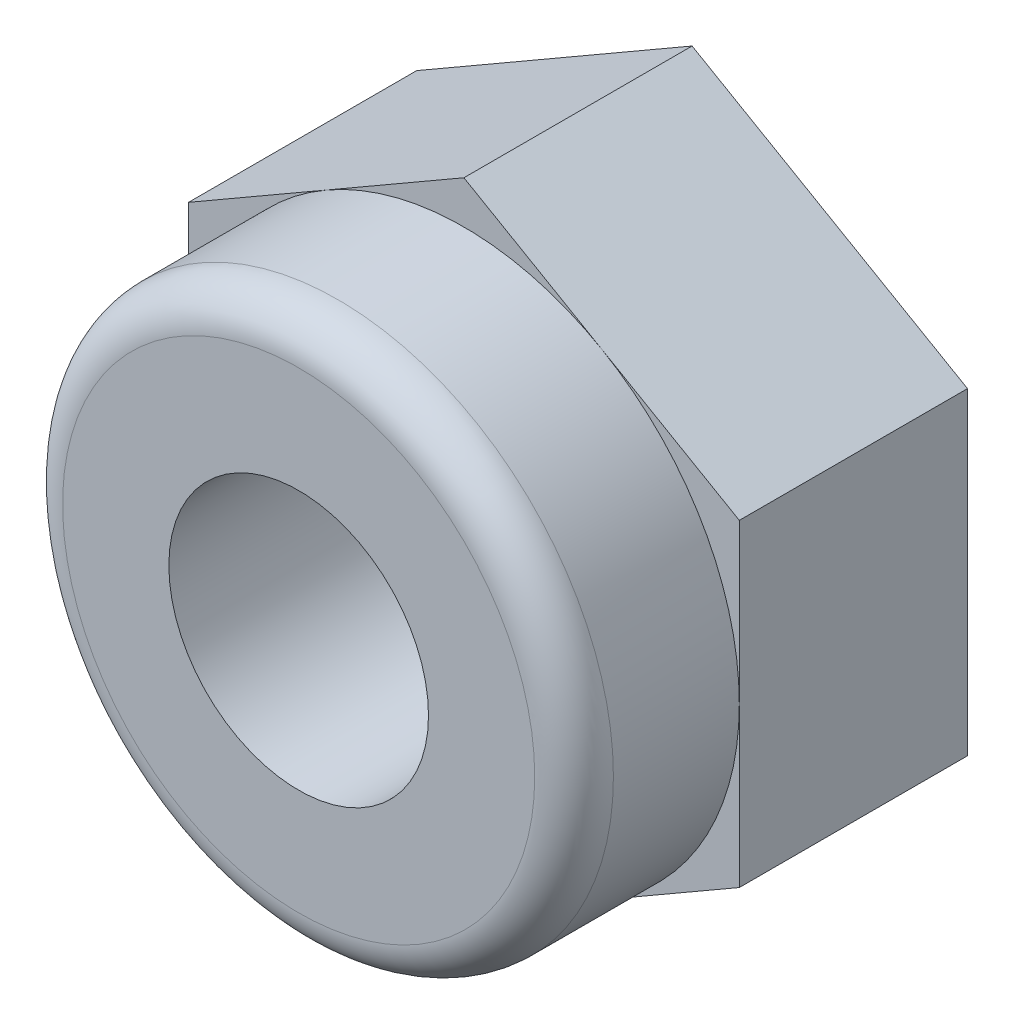
ISO-10303-21;
HEADER;
FILE_DESCRIPTION(('STEP AP214'),'2;1');
FILE_NAME('part.step','',(''),(''),'','','');
FILE_SCHEMA(('AUTOMOTIVE_DESIGN { 1 0 10303 214 1 1 1 1 }'));
ENDSEC;
DATA;
#1=APPLICATION_CONTEXT('core data for automotive mechanical design processes');
#2=APPLICATION_PROTOCOL_DEFINITION('international standard','automotive_design',2000,#1);
#3=PRODUCT_CONTEXT('',#1,'mechanical');
#4=PRODUCT('Part','Part','',(#3));
#5=PRODUCT_RELATED_PRODUCT_CATEGORY('part','',(#4));
#6=PRODUCT_DEFINITION_FORMATION('','',#4);
#7=PRODUCT_DEFINITION_CONTEXT('part definition',#1,'design');
#8=PRODUCT_DEFINITION('design','',#6,#7);
#9=PRODUCT_DEFINITION_SHAPE('','',#8);
#10=(LENGTH_UNIT() NAMED_UNIT(*) SI_UNIT(.MILLI.,.METRE.));
#11=(NAMED_UNIT(*) PLANE_ANGLE_UNIT() SI_UNIT($,.RADIAN.));
#12=(NAMED_UNIT(*) SI_UNIT($,.STERADIAN.) SOLID_ANGLE_UNIT());
#13=UNCERTAINTY_MEASURE_WITH_UNIT(LENGTH_MEASURE(1.E-05),#10,'distance_accuracy_value','');
#14=(GEOMETRIC_REPRESENTATION_CONTEXT(3) GLOBAL_UNCERTAINTY_ASSIGNED_CONTEXT((#13)) GLOBAL_UNIT_ASSIGNED_CONTEXT((#10,
#11,#12)) REPRESENTATION_CONTEXT('',''));
#15=CARTESIAN_POINT('',(0.,0.,0.));
#16=DIRECTION('',(0.,0.,1.));
#17=DIRECTION('',(1.,0.,0.));
#18=AXIS2_PLACEMENT_3D('',#15,#16,#17);
#19=CARTESIAN_POINT('',(0.,0.,2.9));
#20=DIRECTION('',(0.,0.,1.));
#21=DIRECTION('',(1.,0.,0.));
#22=AXIS2_PLACEMENT_3D('',#19,#20,#21);
#23=PLANE('',#22);
#24=CARTESIAN_POINT('',(0.,0.,2.9));
#25=DIRECTION('',(0.,0.,1.));
#26=DIRECTION('',(1.,0.,0.));
#27=AXIS2_PLACEMENT_3D('',#24,#25,#26);
#28=CIRCLE('',#27,3.49999999999999);
#29=CARTESIAN_POINT('',(3.49999999999999,0.,2.9));
#30=VERTEX_POINT('',#29);
#31=CARTESIAN_POINT('',(1.74999999999999,3.03108891324555,2.9));
#32=VERTEX_POINT('',#31);
#33=EDGE_CURVE('E125',#30,#32,#28,.T.);
#34=ORIENTED_EDGE('',*,*,#33,.F.);
#35=DIRECTION('',(0.,1.,0.));
#36=VECTOR('',#35,1.);
#37=CARTESIAN_POINT('',(3.50000000000001,-2.02072594216365,2.9));
#38=LINE('',#37,#36);
#39=CARTESIAN_POINT('',(3.49999999999997,2.02072594216373,2.9));
#40=VERTEX_POINT('',#39);
#41=EDGE_CURVE('E114',#30,#40,#38,.T.);
#42=ORIENTED_EDGE('',*,*,#41,.T.);
#43=DIRECTION('',(-0.866025403784442,0.499999999999995,0.));
#44=VECTOR('',#43,1.);
#45=CARTESIAN_POINT('',(3.49999999999997,2.02072594216373,2.9));
#46=LINE('',#45,#44);
#47=EDGE_CURVE('E126',#40,#32,#46,.T.);
#48=ORIENTED_EDGE('',*,*,#47,.T.);
#49=EDGE_LOOP('',(#34,#42,#48));
#50=FACE_BOUND('',#49,.T.);
#51=ADVANCED_FACE('F36',(#50),#23,.T.);
#52=CARTESIAN_POINT('',(-1.75,3.03108891324553,2.9));
#53=VERTEX_POINT('',#52);
#54=EDGE_CURVE('E132',#32,#53,#28,.T.);
#55=ORIENTED_EDGE('',*,*,#54,.F.);
#56=CARTESIAN_POINT('',(0.,4.04145188432737,2.9));
#57=VERTEX_POINT('',#56);
#58=EDGE_CURVE('E145',#32,#57,#46,.T.);
#59=ORIENTED_EDGE('',*,*,#58,.T.);
#60=DIRECTION('',(-0.866025403784438,-0.500000000000001,0.));
#61=VECTOR('',#60,1.);
#62=CARTESIAN_POINT('',(0.,4.04145188432737,2.9));
#63=LINE('',#62,#61);
#64=EDGE_CURVE('E146',#57,#53,#63,.T.);
#65=ORIENTED_EDGE('',*,*,#64,.T.);
#66=EDGE_LOOP('',(#55,#59,#65));
#67=FACE_BOUND('',#66,.T.);
#68=ADVANCED_FACE('F226',(#67),#23,.T.);
#69=CARTESIAN_POINT('',(-3.49999999999999,0.,2.9));
#70=VERTEX_POINT('',#69);
#71=EDGE_CURVE('E183',#53,#70,#28,.T.);
#72=ORIENTED_EDGE('',*,*,#71,.F.);
#73=CARTESIAN_POINT('',(-3.5,2.02072594216368,2.9));
#74=VERTEX_POINT('',#73);
#75=EDGE_CURVE('E144',#53,#74,#63,.T.);
#76=ORIENTED_EDGE('',*,*,#75,.T.);
#77=DIRECTION('',(0.,-1.,0.));
#78=VECTOR('',#77,1.);
#79=CARTESIAN_POINT('',(-3.5,2.02072594216368,2.9));
#80=LINE('',#79,#78);
#81=EDGE_CURVE('E150',#74,#70,#80,.T.);
#82=ORIENTED_EDGE('',*,*,#81,.T.);
#83=EDGE_LOOP('',(#72,#76,#82));
#84=FACE_BOUND('',#83,.T.);
#85=ADVANCED_FACE('F194',(#84),#23,.T.);
#86=CARTESIAN_POINT('',(-1.74999999999998,-3.03108891324554,2.9));
#87=VERTEX_POINT('',#86);
#88=EDGE_CURVE('E136',#70,#87,#28,.T.);
#89=ORIENTED_EDGE('',*,*,#88,.F.);
#90=CARTESIAN_POINT('',(-3.49999999999998,-2.0207259421637,2.9));
#91=VERTEX_POINT('',#90);
#92=EDGE_CURVE('E149',#70,#91,#80,.T.);
#93=ORIENTED_EDGE('',*,*,#92,.T.);
#94=DIRECTION('',(0.866025403784442,-0.499999999999995,0.));
#95=VECTOR('',#94,1.);
#96=CARTESIAN_POINT('',(-3.49999999999998,-2.0207259421637,2.9));
#97=LINE('',#96,#95);
#98=EDGE_CURVE('E154',#91,#87,#97,.T.);
#99=ORIENTED_EDGE('',*,*,#98,.T.);
#100=EDGE_LOOP('',(#89,#93,#99));
#101=FACE_BOUND('',#100,.T.);
#102=ADVANCED_FACE('F187',(#101),#23,.T.);
#103=CARTESIAN_POINT('',(1.75000000000002,-3.03108891324551,2.9));
#104=VERTEX_POINT('',#103);
#105=EDGE_CURVE('E59',#87,#104,#28,.T.);
#106=ORIENTED_EDGE('',*,*,#105,.F.);
#107=CARTESIAN_POINT('',(0.,-4.04145188432737,2.9));
#108=VERTEX_POINT('',#107);
#109=EDGE_CURVE('E153',#87,#108,#97,.T.);
#110=ORIENTED_EDGE('',*,*,#109,.T.);
#111=DIRECTION('',(0.866025403784435,0.500000000000007,0.));
#112=VECTOR('',#111,1.);
#113=CARTESIAN_POINT('',(0.,-4.04145188432737,2.9));
#114=LINE('',#113,#112);
#115=EDGE_CURVE('E123',#108,#104,#114,.T.);
#116=ORIENTED_EDGE('',*,*,#115,.T.);
#117=EDGE_LOOP('',(#106,#110,#116));
#118=FACE_BOUND('',#117,.T.);
#119=ADVANCED_FACE('F213',(#118),#23,.T.);
#120=CARTESIAN_POINT('',(3.49999999999997,2.02072594216373,2.9));
#121=DIRECTION('',(-0.499999999999995,-0.866025403784442,0.));
#122=DIRECTION('',(0.866025403784442,-0.499999999999995,0.));
#123=AXIS2_PLACEMENT_3D('',#120,#121,#122);
#124=PLANE('',#123);
#125=DIRECTION('',(-0.866025403784442,0.499999999999995,0.));
#126=VECTOR('',#125,1.);
#127=CARTESIAN_POINT('',(3.49999999999997,2.02072594216373,0.));
#128=LINE('',#127,#126);
#129=CARTESIAN_POINT('',(3.49999999999997,2.02072594216373,0.));
#130=VERTEX_POINT('',#129);
#131=CARTESIAN_POINT('',(0.,4.04145188432737,0.));
#132=VERTEX_POINT('',#131);
#133=EDGE_CURVE('E129',#130,#132,#128,.T.);
#134=ORIENTED_EDGE('',*,*,#133,.T.);
#135=DIRECTION('',(0.,0.,-1.));
#136=VECTOR('',#135,1.);
#137=CARTESIAN_POINT('',(0.,4.04145188432737,2.9));
#138=LINE('',#137,#136);
#139=EDGE_CURVE('E135',#57,#132,#138,.T.);
#140=ORIENTED_EDGE('',*,*,#139,.F.);
#141=ORIENTED_EDGE('',*,*,#58,.F.);
#142=ORIENTED_EDGE('',*,*,#47,.F.);
#143=DIRECTION('',(0.,0.,-1.));
#144=VECTOR('',#143,1.);
#145=CARTESIAN_POINT('',(3.49999999999997,2.02072594216373,2.9));
#146=LINE('',#145,#144);
#147=EDGE_CURVE('E113',#40,#130,#146,.T.);
#148=ORIENTED_EDGE('',*,*,#147,.T.);
#149=EDGE_LOOP('',(#134,#140,#141,#142,#148));
#150=FACE_BOUND('',#149,.T.);
#151=ADVANCED_FACE('F215',(#150),#124,.F.);
#152=CARTESIAN_POINT('',(0.,4.04145188432737,2.9));
#153=DIRECTION('',(0.500000000000001,-0.866025403784438,0.));
#154=DIRECTION('',(0.866025403784438,0.500000000000001,0.));
#155=AXIS2_PLACEMENT_3D('',#152,#153,#154);
#156=PLANE('',#155);
#157=DIRECTION('',(-0.866025403784438,-0.500000000000001,0.));
#158=VECTOR('',#157,1.);
#159=CARTESIAN_POINT('',(0.,4.04145188432737,0.));
#160=LINE('',#159,#158);
#161=CARTESIAN_POINT('',(-3.5,2.02072594216368,0.));
#162=VERTEX_POINT('',#161);
#163=EDGE_CURVE('E160',#132,#162,#160,.T.);
#164=ORIENTED_EDGE('',*,*,#163,.T.);
#165=DIRECTION('',(0.,0.,-1.));
#166=VECTOR('',#165,1.);
#167=CARTESIAN_POINT('',(-3.5,2.02072594216368,2.9));
#168=LINE('',#167,#166);
#169=EDGE_CURVE('E138',#74,#162,#168,.T.);
#170=ORIENTED_EDGE('',*,*,#169,.F.);
#171=ORIENTED_EDGE('',*,*,#75,.F.);
#172=ORIENTED_EDGE('',*,*,#64,.F.);
#173=ORIENTED_EDGE('',*,*,#139,.T.);
#174=EDGE_LOOP('',(#164,#170,#171,#172,#173));
#175=FACE_BOUND('',#174,.T.);
#176=ADVANCED_FACE('F199',(#175),#156,.F.);
#177=CARTESIAN_POINT('',(-3.5,2.02072594216368,2.9));
#178=DIRECTION('',(1.,0.,0.));
#179=DIRECTION('',(0.,1.,0.));
#180=AXIS2_PLACEMENT_3D('',#177,#178,#179);
#181=PLANE('',#180);
#182=DIRECTION('',(0.,-1.,0.));
#183=VECTOR('',#182,1.);
#184=CARTESIAN_POINT('',(-3.5,2.02072594216368,0.));
#185=LINE('',#184,#183);
#186=CARTESIAN_POINT('',(-3.49999999999998,-2.0207259421637,0.));
#187=VERTEX_POINT('',#186);
#188=EDGE_CURVE('E162',#162,#187,#185,.T.);
#189=ORIENTED_EDGE('',*,*,#188,.T.);
#190=DIRECTION('',(0.,0.,-1.));
#191=VECTOR('',#190,1.);
#192=CARTESIAN_POINT('',(-3.49999999999998,-2.0207259421637,2.9));
#193=LINE('',#192,#191);
#194=EDGE_CURVE('E176',#91,#187,#193,.T.);
#195=ORIENTED_EDGE('',*,*,#194,.F.);
#196=ORIENTED_EDGE('',*,*,#92,.F.);
#197=ORIENTED_EDGE('',*,*,#81,.F.);
#198=ORIENTED_EDGE('',*,*,#169,.T.);
#199=EDGE_LOOP('',(#189,#195,#196,#197,#198));
#200=FACE_BOUND('',#199,.T.);
#201=ADVANCED_FACE('F192',(#200),#181,.F.);
#202=CARTESIAN_POINT('',(-3.49999999999998,-2.0207259421637,2.9));
#203=DIRECTION('',(0.499999999999995,0.866025403784442,0.));
#204=DIRECTION('',(-0.866025403784442,0.499999999999995,0.));
#205=AXIS2_PLACEMENT_3D('',#202,#203,#204);
#206=PLANE('',#205);
#207=DIRECTION('',(0.866025403784442,-0.499999999999995,0.));
#208=VECTOR('',#207,1.);
#209=CARTESIAN_POINT('',(-3.49999999999998,-2.0207259421637,0.));
#210=LINE('',#209,#208);
#211=CARTESIAN_POINT('',(0.,-4.04145188432737,0.));
#212=VERTEX_POINT('',#211);
#213=EDGE_CURVE('E164',#187,#212,#210,.T.);
#214=ORIENTED_EDGE('',*,*,#213,.T.);
#215=DIRECTION('',(0.,0.,-1.));
#216=VECTOR('',#215,1.);
#217=CARTESIAN_POINT('',(0.,-4.04145188432737,2.9));
#218=LINE('',#217,#216);
#219=EDGE_CURVE('E173',#108,#212,#218,.T.);
#220=ORIENTED_EDGE('',*,*,#219,.F.);
#221=ORIENTED_EDGE('',*,*,#109,.F.);
#222=ORIENTED_EDGE('',*,*,#98,.F.);
#223=ORIENTED_EDGE('',*,*,#194,.T.);
#224=EDGE_LOOP('',(#214,#220,#221,#222,#223));
#225=FACE_BOUND('',#224,.T.);
#226=ADVANCED_FACE('F209',(#225),#206,.F.);
#227=CARTESIAN_POINT('',(0.,-4.04145188432737,2.9));
#228=DIRECTION('',(-0.500000000000007,0.866025403784435,0.));
#229=DIRECTION('',(-0.866025403784435,-0.500000000000007,0.));
#230=AXIS2_PLACEMENT_3D('',#227,#228,#229);
#231=PLANE('',#230);
#232=DIRECTION('',(0.866025403784435,0.500000000000007,0.));
#233=VECTOR('',#232,1.);
#234=CARTESIAN_POINT('',(0.,-4.04145188432737,0.));
#235=LINE('',#234,#233);
#236=CARTESIAN_POINT('',(3.50000000000001,-2.02072594216365,0.));
#237=VERTEX_POINT('',#236);
#238=EDGE_CURVE('E166',#212,#237,#235,.T.);
#239=ORIENTED_EDGE('',*,*,#238,.T.);
#240=DIRECTION('',(0.,0.,-1.));
#241=VECTOR('',#240,1.);
#242=CARTESIAN_POINT('',(3.50000000000001,-2.02072594216365,2.9));
#243=LINE('',#242,#241);
#244=CARTESIAN_POINT('',(3.50000000000001,-2.02072594216365,2.9));
#245=VERTEX_POINT('',#244);
#246=EDGE_CURVE('E171',#245,#237,#243,.T.);
#247=ORIENTED_EDGE('',*,*,#246,.F.);
#248=EDGE_CURVE('E109',#104,#245,#114,.T.);
#249=ORIENTED_EDGE('',*,*,#248,.F.);
#250=ORIENTED_EDGE('',*,*,#115,.F.);
#251=ORIENTED_EDGE('',*,*,#219,.T.);
#252=EDGE_LOOP('',(#239,#247,#249,#250,#251));
#253=FACE_BOUND('',#252,.T.);
#254=ADVANCED_FACE('F212',(#253),#231,.F.);
#255=CARTESIAN_POINT('',(3.50000000000001,-2.02072594216365,2.9));
#256=DIRECTION('',(-1.,0.,0.));
#257=DIRECTION('',(0.,-1.,0.));
#258=AXIS2_PLACEMENT_3D('',#255,#256,#257);
#259=PLANE('',#258);
#260=DIRECTION('',(0.,1.,0.));
#261=VECTOR('',#260,1.);
#262=CARTESIAN_POINT('',(3.50000000000001,-2.02072594216365,0.));
#263=LINE('',#262,#261);
#264=EDGE_CURVE('E168',#237,#130,#263,.T.);
#265=ORIENTED_EDGE('',*,*,#264,.T.);
#266=ORIENTED_EDGE('',*,*,#147,.F.);
#267=ORIENTED_EDGE('',*,*,#41,.F.);
#268=EDGE_CURVE('E106',#245,#30,#38,.T.);
#269=ORIENTED_EDGE('',*,*,#268,.F.);
#270=ORIENTED_EDGE('',*,*,#246,.T.);
#271=EDGE_LOOP('',(#265,#266,#267,#269,#270));
#272=FACE_BOUND('',#271,.T.);
#273=ADVANCED_FACE('F118',(#272),#259,.F.);
#274=EDGE_CURVE('E51',#104,#30,#28,.T.);
#275=ORIENTED_EDGE('',*,*,#274,.F.);
#276=ORIENTED_EDGE('',*,*,#248,.T.);
#277=ORIENTED_EDGE('',*,*,#268,.T.);
#278=EDGE_LOOP('',(#275,#276,#277));
#279=FACE_BOUND('',#278,.T.);
#280=ADVANCED_FACE('F108',(#279),#23,.T.);
#281=CARTESIAN_POINT('',(0.,0.,0.));
#282=DIRECTION('',(0.,0.,1.));
#283=DIRECTION('',(1.,0.,0.));
#284=AXIS2_PLACEMENT_3D('',#281,#282,#283);
#285=PLANE('',#284);
#286=CARTESIAN_POINT('',(0.,0.,0.));
#287=DIRECTION('',(0.,0.,1.));
#288=DIRECTION('',(1.,0.,0.));
#289=AXIS2_PLACEMENT_3D('',#286,#287,#288);
#290=CIRCLE('',#289,1.65);
#291=CARTESIAN_POINT('',(1.65,0.,0.));
#292=VERTEX_POINT('',#291);
#293=EDGE_CURVE('E130',#292,#292,#290,.T.);
#294=ORIENTED_EDGE('',*,*,#293,.T.);
#295=EDGE_LOOP('',(#294));
#296=FACE_BOUND('',#295,.T.);
#297=ORIENTED_EDGE('',*,*,#133,.F.);
#298=ORIENTED_EDGE('',*,*,#264,.F.);
#299=ORIENTED_EDGE('',*,*,#238,.F.);
#300=ORIENTED_EDGE('',*,*,#213,.F.);
#301=ORIENTED_EDGE('',*,*,#188,.F.);
#302=ORIENTED_EDGE('',*,*,#163,.F.);
#303=EDGE_LOOP('',(#297,#298,#299,#300,#301,#302));
#304=FACE_BOUND('',#303,.T.);
#305=ADVANCED_FACE('F204',(#296,#304),#285,.F.);
#306=CARTESIAN_POINT('',(0.,0.,5.));
#307=DIRECTION('',(0.,0.,-1.));
#308=DIRECTION('',(-1.,0.,0.));
#309=AXIS2_PLACEMENT_3D('',#306,#307,#308);
#310=CYLINDRICAL_SURFACE('',#309,3.49999999999999);
#311=CARTESIAN_POINT('',(0.,0.,4.5));
#312=DIRECTION('',(0.,0.,1.));
#313=DIRECTION('',(1.,0.,0.));
#314=AXIS2_PLACEMENT_3D('',#311,#312,#313);
#315=CIRCLE('',#314,3.49999999999999);
#316=CARTESIAN_POINT('',(3.49999999999999,0.,4.5));
#317=VERTEX_POINT('',#316);
#318=EDGE_CURVE('E11',#317,#317,#315,.F.);
#319=ORIENTED_EDGE('',*,*,#318,.T.);
#320=EDGE_LOOP('',(#319));
#321=FACE_BOUND('',#320,.T.);
#322=ORIENTED_EDGE('',*,*,#33,.T.);
#323=ORIENTED_EDGE('',*,*,#54,.T.);
#324=ORIENTED_EDGE('',*,*,#71,.T.);
#325=ORIENTED_EDGE('',*,*,#88,.T.);
#326=ORIENTED_EDGE('',*,*,#105,.T.);
#327=ORIENTED_EDGE('',*,*,#274,.T.);
#328=EDGE_LOOP('',(#322,#323,#324,#325,#326,#327));
#329=FACE_BOUND('',#328,.T.);
#330=ADVANCED_FACE('F133',(#321,#329),#310,.T.);
#331=CARTESIAN_POINT('',(0.,0.,5.));
#332=DIRECTION('',(0.,0.,1.));
#333=DIRECTION('',(1.,0.,0.));
#334=AXIS2_PLACEMENT_3D('',#331,#332,#333);
#335=PLANE('',#334);
#336=CARTESIAN_POINT('',(0.,0.,5.));
#337=DIRECTION('',(0.,0.,1.));
#338=DIRECTION('',(1.,0.,0.));
#339=AXIS2_PLACEMENT_3D('',#336,#337,#338);
#340=CIRCLE('',#339,1.65);
#341=CARTESIAN_POINT('',(1.65,0.,5.));
#342=VERTEX_POINT('',#341);
#343=EDGE_CURVE('E354',#342,#342,#340,.T.);
#344=ORIENTED_EDGE('',*,*,#343,.F.);
#345=EDGE_LOOP('',(#344));
#346=FACE_BOUND('',#345,.T.);
#347=CARTESIAN_POINT('',(0.,0.,5.));
#348=DIRECTION('',(0.,0.,1.));
#349=DIRECTION('',(1.,0.,0.));
#350=AXIS2_PLACEMENT_3D('',#347,#348,#349);
#351=CIRCLE('',#350,2.99999999999999);
#352=CARTESIAN_POINT('',(2.99999999999999,0.,5.));
#353=VERTEX_POINT('',#352);
#354=EDGE_CURVE('E44',#353,#353,#351,.T.);
#355=ORIENTED_EDGE('',*,*,#354,.T.);
#356=EDGE_LOOP('',(#355));
#357=FACE_BOUND('',#356,.T.);
#358=ADVANCED_FACE('F309',(#346,#357),#335,.T.);
#359=CARTESIAN_POINT('',(0.,0.,4.5));
#360=DIRECTION('',(0.,0.,1.));
#361=DIRECTION('',(1.,0.,0.));
#362=AXIS2_PLACEMENT_3D('',#359,#360,#361);
#363=TOROIDAL_SURFACE('',#362,2.99999999999999,0.5);
#364=ORIENTED_EDGE('',*,*,#318,.F.);
#365=EDGE_LOOP('',(#364));
#366=FACE_BOUND('',#365,.T.);
#367=ORIENTED_EDGE('',*,*,#354,.F.);
#368=EDGE_LOOP('',(#367));
#369=FACE_BOUND('',#368,.T.);
#370=ADVANCED_FACE('F38',(#366,#369),#363,.T.);
#371=CARTESIAN_POINT('',(0.,0.,5.));
#372=DIRECTION('',(0.,0.,1.));
#373=DIRECTION('',(1.,0.,0.));
#374=AXIS2_PLACEMENT_3D('',#371,#372,#373);
#375=CYLINDRICAL_SURFACE('',#374,1.65);
#376=ORIENTED_EDGE('',*,*,#293,.F.);
#377=EDGE_LOOP('',(#376));
#378=FACE_BOUND('',#377,.T.);
#379=ORIENTED_EDGE('',*,*,#343,.T.);
#380=EDGE_LOOP('',(#379));
#381=FACE_BOUND('',#380,.T.);
#382=ADVANCED_FACE('F321',(#378,#381),#375,.F.);
#383=CLOSED_SHELL('',(#51,#68,#85,#102,#119,#151,#176,#201,#226,#254,#273,#280,#305,#330,#358,
#370,#382));
#384=MANIFOLD_SOLID_BREP('B2',#383);
#385=ADVANCED_BREP_SHAPE_REPRESENTATION('',(#18,#384),#14);
#386=SHAPE_DEFINITION_REPRESENTATION(#9,#385);
ENDSEC;
END-ISO-10303-21;
